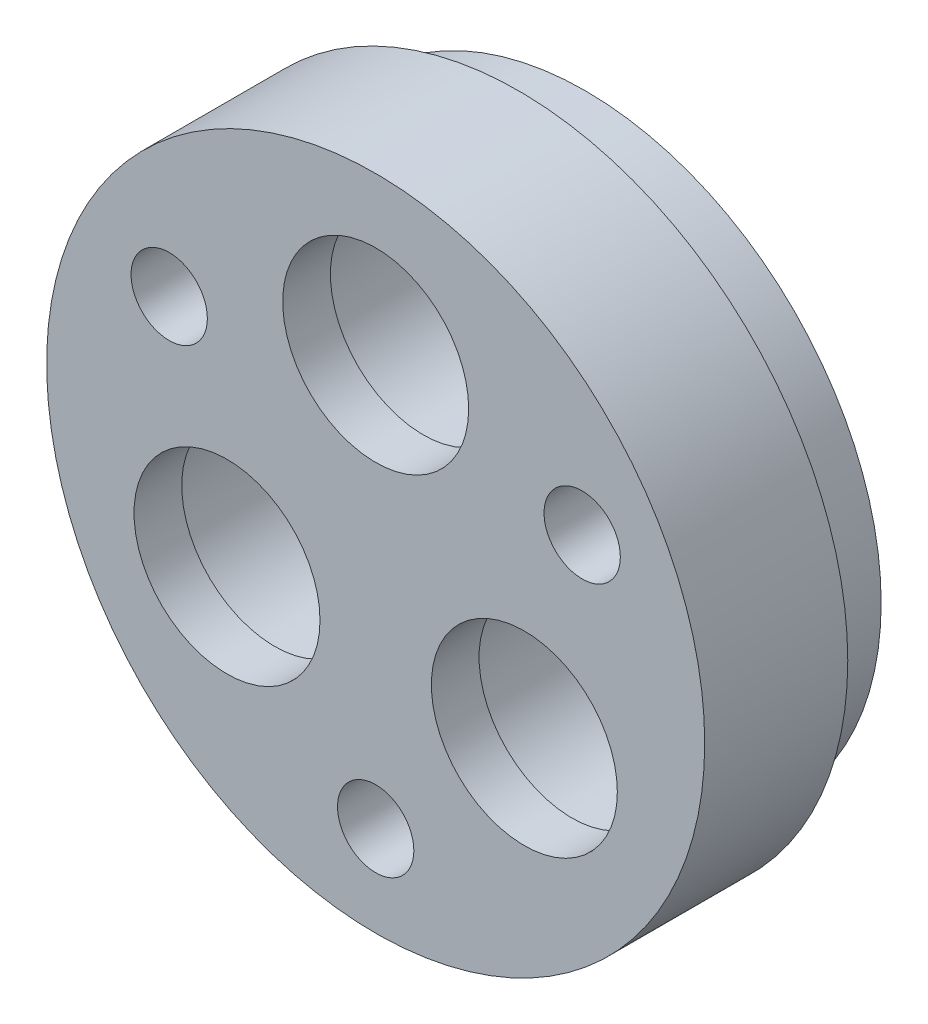
ISO-10303-21;
HEADER;
FILE_DESCRIPTION(('STEP AP214'),'2;1');
FILE_NAME('part.step','',(''),(''),'','','');
FILE_SCHEMA(('AUTOMOTIVE_DESIGN { 1 0 10303 214 1 1 1 1 }'));
ENDSEC;
DATA;
#1=APPLICATION_CONTEXT('core data for automotive mechanical design processes');
#2=APPLICATION_PROTOCOL_DEFINITION('international standard','automotive_design',2000,#1);
#3=PRODUCT_CONTEXT('',#1,'mechanical');
#4=PRODUCT('Part','Part','',(#3));
#5=PRODUCT_RELATED_PRODUCT_CATEGORY('part','',(#4));
#6=PRODUCT_DEFINITION_FORMATION('','',#4);
#7=PRODUCT_DEFINITION_CONTEXT('part definition',#1,'design');
#8=PRODUCT_DEFINITION('design','',#6,#7);
#9=PRODUCT_DEFINITION_SHAPE('','',#8);
#10=(LENGTH_UNIT() NAMED_UNIT(*) SI_UNIT(.MILLI.,.METRE.));
#11=(NAMED_UNIT(*) PLANE_ANGLE_UNIT() SI_UNIT($,.RADIAN.));
#12=(NAMED_UNIT(*) SI_UNIT($,.STERADIAN.) SOLID_ANGLE_UNIT());
#13=UNCERTAINTY_MEASURE_WITH_UNIT(LENGTH_MEASURE(1.E-05),#10,'distance_accuracy_value','');
#14=(GEOMETRIC_REPRESENTATION_CONTEXT(3) GLOBAL_UNCERTAINTY_ASSIGNED_CONTEXT((#13)) GLOBAL_UNIT_ASSIGNED_CONTEXT((#10,
#11,#12)) REPRESENTATION_CONTEXT('',''));
#15=CARTESIAN_POINT('',(0.,0.,0.));
#16=DIRECTION('',(0.,0.,1.));
#17=DIRECTION('',(1.,0.,0.));
#18=AXIS2_PLACEMENT_3D('',#15,#16,#17);
#19=CARTESIAN_POINT('',(-15.5884572681199,-9.00000000000001,0.));
#20=DIRECTION('',(0.,0.,1.));
#21=DIRECTION('',(1.,0.,0.));
#22=AXIS2_PLACEMENT_3D('',#19,#20,#21);
#23=CYLINDRICAL_SURFACE('',#22,10.8);
#24=CARTESIAN_POINT('',(-15.5884572681199,-9.00000000000001,10.));
#25=DIRECTION('',(0.,0.,1.));
#26=DIRECTION('',(1.,0.,0.));
#27=AXIS2_PLACEMENT_3D('',#24,#25,#26);
#28=CIRCLE('',#27,10.8);
#29=CARTESIAN_POINT('',(-4.78845726811989,-9.00000000000001,10.));
#30=VERTEX_POINT('',#29);
#31=EDGE_CURVE('E47',#30,#30,#28,.F.);
#32=ORIENTED_EDGE('',*,*,#31,.F.);
#33=EDGE_LOOP('',(#32));
#34=FACE_BOUND('',#33,.T.);
#35=CARTESIAN_POINT('',(-15.5884572681199,-9.00000000000001,-7.));
#36=DIRECTION('',(0.,0.,-1.));
#37=DIRECTION('',(-1.,0.,0.));
#38=AXIS2_PLACEMENT_3D('',#35,#36,#37);
#39=CIRCLE('',#38,10.8);
#40=CARTESIAN_POINT('',(-26.3884572681199,-9.00000000000001,-7.));
#41=VERTEX_POINT('',#40);
#42=EDGE_CURVE('E133',#41,#41,#39,.T.);
#43=ORIENTED_EDGE('',*,*,#42,.T.);
#44=EDGE_LOOP('',(#43));
#45=FACE_BOUND('',#44,.T.);
#46=ADVANCED_FACE('F44',(#34,#45),#23,.F.);
#47=CARTESIAN_POINT('',(15.5884572681199,-9.,0.));
#48=DIRECTION('',(0.,0.,1.));
#49=DIRECTION('',(1.,0.,0.));
#50=AXIS2_PLACEMENT_3D('',#47,#48,#49);
#51=CYLINDRICAL_SURFACE('',#50,10.8);
#52=CARTESIAN_POINT('',(15.5884572681199,-9.,10.));
#53=DIRECTION('',(0.,0.,1.));
#54=DIRECTION('',(1.,0.,0.));
#55=AXIS2_PLACEMENT_3D('',#52,#53,#54);
#56=CIRCLE('',#55,10.8);
#57=CARTESIAN_POINT('',(26.3884572681199,-9.,10.));
#58=VERTEX_POINT('',#57);
#59=EDGE_CURVE('E56',#58,#58,#56,.F.);
#60=ORIENTED_EDGE('',*,*,#59,.F.);
#61=EDGE_LOOP('',(#60));
#62=FACE_BOUND('',#61,.T.);
#63=CARTESIAN_POINT('',(15.5884572681199,-9.,-7.));
#64=DIRECTION('',(0.,0.,-1.));
#65=DIRECTION('',(-1.,0.,0.));
#66=AXIS2_PLACEMENT_3D('',#63,#64,#65);
#67=CIRCLE('',#66,10.8);
#68=CARTESIAN_POINT('',(4.7884572681199,-9.,-7.));
#69=VERTEX_POINT('',#68);
#70=EDGE_CURVE('E121',#69,#69,#67,.T.);
#71=ORIENTED_EDGE('',*,*,#70,.T.);
#72=EDGE_LOOP('',(#71));
#73=FACE_BOUND('',#72,.T.);
#74=ADVANCED_FACE('F120',(#62,#73),#51,.F.);
#75=CARTESIAN_POINT('',(0.,18.,0.));
#76=DIRECTION('',(0.,0.,1.));
#77=DIRECTION('',(1.,0.,0.));
#78=AXIS2_PLACEMENT_3D('',#75,#76,#77);
#79=CYLINDRICAL_SURFACE('',#78,10.8);
#80=CARTESIAN_POINT('',(0.,18.,10.));
#81=DIRECTION('',(0.,0.,1.));
#82=DIRECTION('',(1.,0.,0.));
#83=AXIS2_PLACEMENT_3D('',#80,#81,#82);
#84=CIRCLE('',#83,10.8);
#85=CARTESIAN_POINT('',(10.8,18.,10.));
#86=VERTEX_POINT('',#85);
#87=EDGE_CURVE('E102',#86,#86,#84,.F.);
#88=ORIENTED_EDGE('',*,*,#87,.F.);
#89=EDGE_LOOP('',(#88));
#90=FACE_BOUND('',#89,.T.);
#91=CARTESIAN_POINT('',(0.,18.,-7.));
#92=DIRECTION('',(0.,0.,-1.));
#93=DIRECTION('',(-1.,0.,0.));
#94=AXIS2_PLACEMENT_3D('',#91,#92,#93);
#95=CIRCLE('',#94,10.8);
#96=CARTESIAN_POINT('',(-10.8,18.,-7.));
#97=VERTEX_POINT('',#96);
#98=EDGE_CURVE('E129',#97,#97,#95,.T.);
#99=ORIENTED_EDGE('',*,*,#98,.T.);
#100=EDGE_LOOP('',(#99));
#101=FACE_BOUND('',#100,.T.);
#102=ADVANCED_FACE('F119',(#90,#101),#79,.F.);
#103=CARTESIAN_POINT('',(0.,0.,15.));
#104=DIRECTION('',(0.,0.,-1.));
#105=DIRECTION('',(-1.,0.,0.));
#106=AXIS2_PLACEMENT_3D('',#103,#104,#105);
#107=CYLINDRICAL_SURFACE('',#106,34.5);
#108=CARTESIAN_POINT('',(0.,0.,15.));
#109=DIRECTION('',(0.,0.,1.));
#110=DIRECTION('',(1.,0.,0.));
#111=AXIS2_PLACEMENT_3D('',#108,#109,#110);
#112=CIRCLE('',#111,34.5);
#113=CARTESIAN_POINT('',(34.5,0.,15.));
#114=VERTEX_POINT('',#113);
#115=EDGE_CURVE('E103',#114,#114,#112,.T.);
#116=ORIENTED_EDGE('',*,*,#115,.F.);
#117=EDGE_LOOP('',(#116));
#118=FACE_BOUND('',#117,.T.);
#119=CARTESIAN_POINT('',(0.,0.,0.));
#120=DIRECTION('',(0.,0.,1.));
#121=DIRECTION('',(1.,0.,0.));
#122=AXIS2_PLACEMENT_3D('',#119,#120,#121);
#123=CIRCLE('',#122,34.5);
#124=CARTESIAN_POINT('',(34.5,0.,0.));
#125=VERTEX_POINT('',#124);
#126=EDGE_CURVE('E82',#125,#125,#123,.T.);
#127=ORIENTED_EDGE('',*,*,#126,.T.);
#128=EDGE_LOOP('',(#127));
#129=FACE_BOUND('',#128,.T.);
#130=ADVANCED_FACE('F50',(#118,#129),#107,.T.);
#131=CARTESIAN_POINT('',(0.,0.,15.));
#132=DIRECTION('',(0.,0.,1.));
#133=DIRECTION('',(1.,0.,0.));
#134=AXIS2_PLACEMENT_3D('',#131,#132,#133);
#135=PLANE('',#134);
#136=CARTESIAN_POINT('',(21.650635094611,12.5,15.));
#137=DIRECTION('',(0.,0.,1.));
#138=DIRECTION('',(1.,0.,0.));
#139=AXIS2_PLACEMENT_3D('',#136,#137,#138);
#140=CIRCLE('',#139,4.);
#141=CARTESIAN_POINT('',(25.650635094611,12.5,15.));
#142=VERTEX_POINT('',#141);
#143=EDGE_CURVE('E61',#142,#142,#140,.T.);
#144=ORIENTED_EDGE('',*,*,#143,.F.);
#145=EDGE_LOOP('',(#144));
#146=FACE_BOUND('',#145,.T.);
#147=CARTESIAN_POINT('',(-21.650635094611,12.5,15.));
#148=DIRECTION('',(0.,0.,1.));
#149=DIRECTION('',(1.,0.,0.));
#150=AXIS2_PLACEMENT_3D('',#147,#148,#149);
#151=CIRCLE('',#150,4.);
#152=CARTESIAN_POINT('',(-17.650635094611,12.5,15.));
#153=VERTEX_POINT('',#152);
#154=EDGE_CURVE('E68',#153,#153,#151,.T.);
#155=ORIENTED_EDGE('',*,*,#154,.F.);
#156=EDGE_LOOP('',(#155));
#157=FACE_BOUND('',#156,.T.);
#158=CARTESIAN_POINT('',(0.,-25.,15.));
#159=DIRECTION('',(0.,0.,1.));
#160=DIRECTION('',(1.,0.,0.));
#161=AXIS2_PLACEMENT_3D('',#158,#159,#160);
#162=CIRCLE('',#161,4.);
#163=CARTESIAN_POINT('',(4.,-25.,15.));
#164=VERTEX_POINT('',#163);
#165=EDGE_CURVE('E71',#164,#164,#162,.T.);
#166=ORIENTED_EDGE('',*,*,#165,.F.);
#167=EDGE_LOOP('',(#166));
#168=FACE_BOUND('',#167,.T.);
#169=ORIENTED_EDGE('',*,*,#115,.T.);
#170=EDGE_LOOP('',(#169));
#171=FACE_BOUND('',#170,.T.);
#172=CARTESIAN_POINT('',(-15.588457268118,-9.00000000000111,15.));
#173=DIRECTION('',(0.,0.,1.));
#174=DIRECTION('',(1.,0.,0.));
#175=AXIS2_PLACEMENT_3D('',#172,#173,#174);
#176=CIRCLE('',#175,9.75000000000232);
#177=CARTESIAN_POINT('',(-5.83845726811566,-9.00000000000111,15.));
#178=VERTEX_POINT('',#177);
#179=EDGE_CURVE('E94',#178,#178,#176,.T.);
#180=ORIENTED_EDGE('',*,*,#179,.F.);
#181=EDGE_LOOP('',(#180));
#182=FACE_BOUND('',#181,.T.);
#183=CARTESIAN_POINT('',(15.5884572681218,-8.9999999999989,15.));
#184=DIRECTION('',(0.,0.,1.));
#185=DIRECTION('',(1.,0.,0.));
#186=AXIS2_PLACEMENT_3D('',#183,#184,#185);
#187=CIRCLE('',#186,9.75000000000159);
#188=CARTESIAN_POINT('',(25.3384572681234,-8.9999999999989,15.));
#189=VERTEX_POINT('',#188);
#190=EDGE_CURVE('E86',#189,#189,#187,.T.);
#191=ORIENTED_EDGE('',*,*,#190,.F.);
#192=EDGE_LOOP('',(#191));
#193=FACE_BOUND('',#192,.T.);
#194=CARTESIAN_POINT('',(0.,18.,15.));
#195=DIRECTION('',(0.,0.,1.));
#196=DIRECTION('',(1.,0.,0.));
#197=AXIS2_PLACEMENT_3D('',#194,#195,#196);
#198=CIRCLE('',#197,9.75);
#199=CARTESIAN_POINT('',(9.75,18.,15.));
#200=VERTEX_POINT('',#199);
#201=EDGE_CURVE('E85',#200,#200,#198,.T.);
#202=ORIENTED_EDGE('',*,*,#201,.F.);
#203=EDGE_LOOP('',(#202));
#204=FACE_BOUND('',#203,.T.);
#205=ADVANCED_FACE('F180',(#146,#157,#168,#171,#182,#193,#204),#135,.T.);
#206=CARTESIAN_POINT('',(0.,0.,0.));
#207=DIRECTION('',(0.,0.,1.));
#208=DIRECTION('',(1.,0.,0.));
#209=AXIS2_PLACEMENT_3D('',#206,#207,#208);
#210=PLANE('',#209);
#211=CARTESIAN_POINT('',(0.,0.,0.));
#212=DIRECTION('',(0.,0.,-1.));
#213=DIRECTION('',(-1.,0.,0.));
#214=AXIS2_PLACEMENT_3D('',#211,#212,#213);
#215=CIRCLE('',#214,31.);
#216=CARTESIAN_POINT('',(-31.,0.,0.));
#217=VERTEX_POINT('',#216);
#218=EDGE_CURVE('E10',#217,#217,#215,.T.);
#219=ORIENTED_EDGE('',*,*,#218,.F.);
#220=EDGE_LOOP('',(#219));
#221=FACE_BOUND('',#220,.T.);
#222=ORIENTED_EDGE('',*,*,#126,.F.);
#223=EDGE_LOOP('',(#222));
#224=FACE_BOUND('',#223,.T.);
#225=ADVANCED_FACE('F178',(#221,#224),#210,.F.);
#226=CARTESIAN_POINT('',(0.,18.,10.));
#227=DIRECTION('',(0.,0.,1.));
#228=DIRECTION('',(1.,0.,0.));
#229=AXIS2_PLACEMENT_3D('',#226,#227,#228);
#230=PLANE('',#229);
#231=CARTESIAN_POINT('',(0.,18.,10.));
#232=DIRECTION('',(0.,0.,1.));
#233=DIRECTION('',(1.,0.,0.));
#234=AXIS2_PLACEMENT_3D('',#231,#232,#233);
#235=CIRCLE('',#234,9.75);
#236=CARTESIAN_POINT('',(9.75,18.,10.));
#237=VERTEX_POINT('',#236);
#238=EDGE_CURVE('E80',#237,#237,#235,.T.);
#239=ORIENTED_EDGE('',*,*,#238,.T.);
#240=EDGE_LOOP('',(#239));
#241=FACE_BOUND('',#240,.T.);
#242=ORIENTED_EDGE('',*,*,#87,.T.);
#243=EDGE_LOOP('',(#242));
#244=FACE_BOUND('',#243,.T.);
#245=ADVANCED_FACE('F181',(#241,#244),#230,.F.);
#246=CARTESIAN_POINT('',(0.,18.,10.));
#247=DIRECTION('',(0.,0.,1.));
#248=DIRECTION('',(1.,0.,0.));
#249=AXIS2_PLACEMENT_3D('',#246,#247,#248);
#250=CYLINDRICAL_SURFACE('',#249,9.75);
#251=ORIENTED_EDGE('',*,*,#238,.F.);
#252=EDGE_LOOP('',(#251));
#253=FACE_BOUND('',#252,.T.);
#254=ORIENTED_EDGE('',*,*,#201,.T.);
#255=EDGE_LOOP('',(#254));
#256=FACE_BOUND('',#255,.T.);
#257=ADVANCED_FACE('F189',(#253,#256),#250,.F.);
#258=CARTESIAN_POINT('',(15.5884572681218,-8.9999999999989,10.));
#259=DIRECTION('',(0.,0.,1.));
#260=DIRECTION('',(1.,0.,0.));
#261=AXIS2_PLACEMENT_3D('',#258,#259,#260);
#262=PLANE('',#261);
#263=CARTESIAN_POINT('',(15.5884572681218,-8.9999999999989,10.));
#264=DIRECTION('',(0.,0.,1.));
#265=DIRECTION('',(1.,0.,0.));
#266=AXIS2_PLACEMENT_3D('',#263,#264,#265);
#267=CIRCLE('',#266,9.75000000000159);
#268=CARTESIAN_POINT('',(25.3384572681234,-8.9999999999989,10.));
#269=VERTEX_POINT('',#268);
#270=EDGE_CURVE('E90',#269,#269,#267,.T.);
#271=ORIENTED_EDGE('',*,*,#270,.T.);
#272=EDGE_LOOP('',(#271));
#273=FACE_BOUND('',#272,.T.);
#274=ORIENTED_EDGE('',*,*,#59,.T.);
#275=EDGE_LOOP('',(#274));
#276=FACE_BOUND('',#275,.T.);
#277=ADVANCED_FACE('F114',(#273,#276),#262,.F.);
#278=CARTESIAN_POINT('',(15.5884572681218,-8.9999999999989,10.));
#279=DIRECTION('',(0.,0.,1.));
#280=DIRECTION('',(1.,0.,0.));
#281=AXIS2_PLACEMENT_3D('',#278,#279,#280);
#282=CYLINDRICAL_SURFACE('',#281,9.75000000000159);
#283=ORIENTED_EDGE('',*,*,#270,.F.);
#284=EDGE_LOOP('',(#283));
#285=FACE_BOUND('',#284,.T.);
#286=ORIENTED_EDGE('',*,*,#190,.T.);
#287=EDGE_LOOP('',(#286));
#288=FACE_BOUND('',#287,.T.);
#289=ADVANCED_FACE('F211',(#285,#288),#282,.F.);
#290=CARTESIAN_POINT('',(-15.588457268118,-9.00000000000111,10.));
#291=DIRECTION('',(0.,0.,1.));
#292=DIRECTION('',(1.,0.,0.));
#293=AXIS2_PLACEMENT_3D('',#290,#291,#292);
#294=PLANE('',#293);
#295=CARTESIAN_POINT('',(-15.588457268118,-9.00000000000111,10.));
#296=DIRECTION('',(0.,0.,1.));
#297=DIRECTION('',(1.,0.,0.));
#298=AXIS2_PLACEMENT_3D('',#295,#296,#297);
#299=CIRCLE('',#298,9.75000000000232);
#300=CARTESIAN_POINT('',(-5.83845726811566,-9.00000000000111,10.));
#301=VERTEX_POINT('',#300);
#302=EDGE_CURVE('E69',#301,#301,#299,.T.);
#303=ORIENTED_EDGE('',*,*,#302,.T.);
#304=EDGE_LOOP('',(#303));
#305=FACE_BOUND('',#304,.T.);
#306=ORIENTED_EDGE('',*,*,#31,.T.);
#307=EDGE_LOOP('',(#306));
#308=FACE_BOUND('',#307,.T.);
#309=ADVANCED_FACE('F224',(#305,#308),#294,.F.);
#310=CARTESIAN_POINT('',(-15.588457268118,-9.00000000000111,10.));
#311=DIRECTION('',(0.,0.,1.));
#312=DIRECTION('',(1.,0.,0.));
#313=AXIS2_PLACEMENT_3D('',#310,#311,#312);
#314=CYLINDRICAL_SURFACE('',#313,9.75000000000232);
#315=ORIENTED_EDGE('',*,*,#302,.F.);
#316=EDGE_LOOP('',(#315));
#317=FACE_BOUND('',#316,.T.);
#318=ORIENTED_EDGE('',*,*,#179,.T.);
#319=EDGE_LOOP('',(#318));
#320=FACE_BOUND('',#319,.T.);
#321=ADVANCED_FACE('F226',(#317,#320),#314,.F.);
#322=CARTESIAN_POINT('',(0.,-25.,0.));
#323=DIRECTION('',(0.,0.,1.));
#324=DIRECTION('',(1.,0.,0.));
#325=AXIS2_PLACEMENT_3D('',#322,#323,#324);
#326=CYLINDRICAL_SURFACE('',#325,4.);
#327=ORIENTED_EDGE('',*,*,#165,.T.);
#328=EDGE_LOOP('',(#327));
#329=FACE_BOUND('',#328,.T.);
#330=CARTESIAN_POINT('',(0.,-25.,-7.));
#331=DIRECTION('',(0.,0.,-1.));
#332=DIRECTION('',(-1.,0.,0.));
#333=AXIS2_PLACEMENT_3D('',#330,#331,#332);
#334=CIRCLE('',#333,4.);
#335=CARTESIAN_POINT('',(-4.,-25.,-7.));
#336=VERTEX_POINT('',#335);
#337=EDGE_CURVE('E130',#336,#336,#334,.T.);
#338=ORIENTED_EDGE('',*,*,#337,.T.);
#339=EDGE_LOOP('',(#338));
#340=FACE_BOUND('',#339,.T.);
#341=ADVANCED_FACE('F218',(#329,#340),#326,.F.);
#342=CARTESIAN_POINT('',(-21.650635094611,12.5,0.));
#343=DIRECTION('',(0.,0.,1.));
#344=DIRECTION('',(1.,0.,0.));
#345=AXIS2_PLACEMENT_3D('',#342,#343,#344);
#346=CYLINDRICAL_SURFACE('',#345,4.);
#347=ORIENTED_EDGE('',*,*,#154,.T.);
#348=EDGE_LOOP('',(#347));
#349=FACE_BOUND('',#348,.T.);
#350=CARTESIAN_POINT('',(-21.650635094611,12.5,-7.));
#351=DIRECTION('',(0.,0.,-1.));
#352=DIRECTION('',(-1.,0.,0.));
#353=AXIS2_PLACEMENT_3D('',#350,#351,#352);
#354=CIRCLE('',#353,4.);
#355=CARTESIAN_POINT('',(-25.650635094611,12.5,-7.));
#356=VERTEX_POINT('',#355);
#357=EDGE_CURVE('E137',#356,#356,#354,.T.);
#358=ORIENTED_EDGE('',*,*,#357,.T.);
#359=EDGE_LOOP('',(#358));
#360=FACE_BOUND('',#359,.T.);
#361=ADVANCED_FACE('F162',(#349,#360),#346,.F.);
#362=CARTESIAN_POINT('',(21.650635094611,12.5,0.));
#363=DIRECTION('',(0.,0.,1.));
#364=DIRECTION('',(1.,0.,0.));
#365=AXIS2_PLACEMENT_3D('',#362,#363,#364);
#366=CYLINDRICAL_SURFACE('',#365,4.);
#367=ORIENTED_EDGE('',*,*,#143,.T.);
#368=EDGE_LOOP('',(#367));
#369=FACE_BOUND('',#368,.T.);
#370=CARTESIAN_POINT('',(21.650635094611,12.5,-7.));
#371=DIRECTION('',(0.,0.,-1.));
#372=DIRECTION('',(-1.,0.,0.));
#373=AXIS2_PLACEMENT_3D('',#370,#371,#372);
#374=CIRCLE('',#373,4.);
#375=CARTESIAN_POINT('',(17.650635094611,12.5,-7.));
#376=VERTEX_POINT('',#375);
#377=EDGE_CURVE('E144',#376,#376,#374,.T.);
#378=ORIENTED_EDGE('',*,*,#377,.T.);
#379=EDGE_LOOP('',(#378));
#380=FACE_BOUND('',#379,.T.);
#381=ADVANCED_FACE('F146',(#369,#380),#366,.F.);
#382=CARTESIAN_POINT('',(0.,0.,-7.));
#383=DIRECTION('',(0.,0.,-1.));
#384=DIRECTION('',(-1.,0.,0.));
#385=AXIS2_PLACEMENT_3D('',#382,#383,#384);
#386=PLANE('',#385);
#387=ORIENTED_EDGE('',*,*,#357,.F.);
#388=EDGE_LOOP('',(#387));
#389=FACE_BOUND('',#388,.T.);
#390=ORIENTED_EDGE('',*,*,#98,.F.);
#391=EDGE_LOOP('',(#390));
#392=FACE_BOUND('',#391,.T.);
#393=ORIENTED_EDGE('',*,*,#337,.F.);
#394=EDGE_LOOP('',(#393));
#395=FACE_BOUND('',#394,.T.);
#396=CARTESIAN_POINT('',(0.,0.,-7.));
#397=DIRECTION('',(0.,0.,-1.));
#398=DIRECTION('',(-1.,0.,0.));
#399=AXIS2_PLACEMENT_3D('',#396,#397,#398);
#400=CIRCLE('',#399,31.);
#401=CARTESIAN_POINT('',(-31.,0.,-7.));
#402=VERTEX_POINT('',#401);
#403=EDGE_CURVE('E65',#402,#402,#400,.T.);
#404=ORIENTED_EDGE('',*,*,#403,.T.);
#405=EDGE_LOOP('',(#404));
#406=FACE_BOUND('',#405,.T.);
#407=ORIENTED_EDGE('',*,*,#70,.F.);
#408=EDGE_LOOP('',(#407));
#409=FACE_BOUND('',#408,.T.);
#410=ORIENTED_EDGE('',*,*,#42,.F.);
#411=EDGE_LOOP('',(#410));
#412=FACE_BOUND('',#411,.T.);
#413=ORIENTED_EDGE('',*,*,#377,.F.);
#414=EDGE_LOOP('',(#413));
#415=FACE_BOUND('',#414,.T.);
#416=ADVANCED_FACE('F151',(#389,#392,#395,#406,#409,#412,#415),#386,.T.);
#417=CARTESIAN_POINT('',(0.,0.,-7.));
#418=DIRECTION('',(0.,0.,1.));
#419=DIRECTION('',(1.,0.,0.));
#420=AXIS2_PLACEMENT_3D('',#417,#418,#419);
#421=CYLINDRICAL_SURFACE('',#420,31.);
#422=ORIENTED_EDGE('',*,*,#403,.F.);
#423=EDGE_LOOP('',(#422));
#424=FACE_BOUND('',#423,.T.);
#425=ORIENTED_EDGE('',*,*,#218,.T.);
#426=EDGE_LOOP('',(#425));
#427=FACE_BOUND('',#426,.T.);
#428=ADVANCED_FACE('F154',(#424,#427),#421,.T.);
#429=CLOSED_SHELL('',(#46,#74,#102,#130,#205,#225,#245,#257,#277,#289,#309,#321,#341,#361,#381,
#416,#428));
#430=MANIFOLD_SOLID_BREP('B2',#429);
#431=ADVANCED_BREP_SHAPE_REPRESENTATION('',(#18,#430),#14);
#432=SHAPE_DEFINITION_REPRESENTATION(#9,#431);
ENDSEC;
END-ISO-10303-21;
